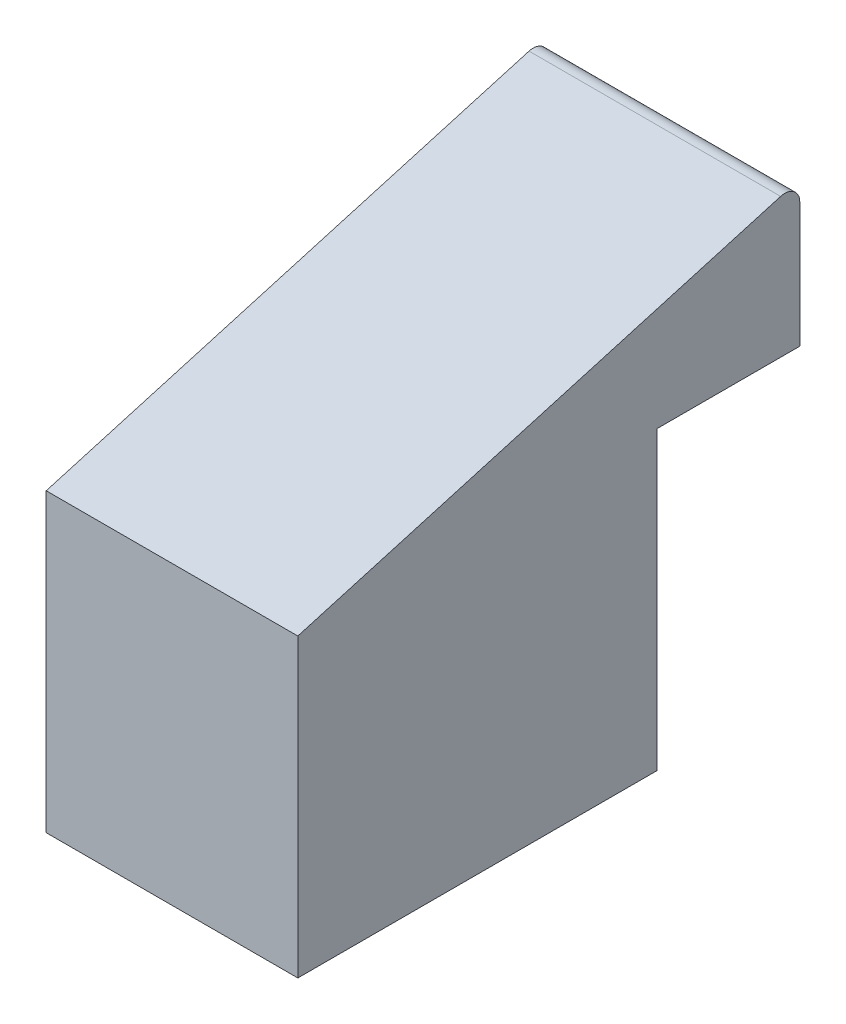
ISO-10303-21;
HEADER;
FILE_DESCRIPTION(('STEP AP214'),'2;1');
FILE_NAME('part.step','',(''),(''),'','','');
FILE_SCHEMA(('AUTOMOTIVE_DESIGN { 1 0 10303 214 1 1 1 1 }'));
ENDSEC;
DATA;
#1=APPLICATION_CONTEXT('core data for automotive mechanical design processes');
#2=APPLICATION_PROTOCOL_DEFINITION('international standard','automotive_design',2000,#1);
#3=PRODUCT_CONTEXT('',#1,'mechanical');
#4=PRODUCT('Part','Part','',(#3));
#5=PRODUCT_RELATED_PRODUCT_CATEGORY('part','',(#4));
#6=PRODUCT_DEFINITION_FORMATION('','',#4);
#7=PRODUCT_DEFINITION_CONTEXT('part definition',#1,'design');
#8=PRODUCT_DEFINITION('design','',#6,#7);
#9=PRODUCT_DEFINITION_SHAPE('','',#8);
#10=(LENGTH_UNIT() NAMED_UNIT(*) SI_UNIT(.MILLI.,.METRE.));
#11=(NAMED_UNIT(*) PLANE_ANGLE_UNIT() SI_UNIT($,.RADIAN.));
#12=(NAMED_UNIT(*) SI_UNIT($,.STERADIAN.) SOLID_ANGLE_UNIT());
#13=UNCERTAINTY_MEASURE_WITH_UNIT(LENGTH_MEASURE(1.E-05),#10,'distance_accuracy_value','');
#14=(GEOMETRIC_REPRESENTATION_CONTEXT(3) GLOBAL_UNCERTAINTY_ASSIGNED_CONTEXT((#13)) GLOBAL_UNIT_ASSIGNED_CONTEXT((#10,
#11,#12)) REPRESENTATION_CONTEXT('',''));
#15=CARTESIAN_POINT('',(0.,0.,0.));
#16=DIRECTION('',(0.,0.,1.));
#17=DIRECTION('',(1.,0.,0.));
#18=AXIS2_PLACEMENT_3D('',#15,#16,#17);
#19=CARTESIAN_POINT('',(2.13449989427818,-8.27705404793357,3.83245450629463));
#20=DIRECTION('',(0.,0.,1.));
#21=DIRECTION('',(1.,0.,0.));
#22=AXIS2_PLACEMENT_3D('',#19,#20,#21);
#23=PLANE('',#22);
#24=DIRECTION('',(0.,-1.,0.));
#25=VECTOR('',#24,1.);
#26=CARTESIAN_POINT('',(4.16649989427817,-8.27705404793357,3.83245450629463));
#27=LINE('',#26,#25);
#28=CARTESIAN_POINT('',(4.16649989427817,-8.27705404793357,3.83245450629463));
#29=VERTEX_POINT('',#28);
#30=CARTESIAN_POINT('',(4.16649989427812,-28.3755392640244,3.83245450629463));
#31=VERTEX_POINT('',#30);
#32=EDGE_CURVE('E65',#29,#31,#27,.T.);
#33=ORIENTED_EDGE('',*,*,#32,.T.);
#34=DIRECTION('',(1.,0.,0.));
#35=VECTOR('',#34,1.);
#36=CARTESIAN_POINT('',(-224.629539586356,-28.3755392640244,3.83245450629463));
#37=LINE('',#36,#35);
#38=CARTESIAN_POINT('',(2.13449989427814,-28.3755392640244,3.83245450629463));
#39=VERTEX_POINT('',#38);
#40=EDGE_CURVE('E146',#39,#31,#37,.T.);
#41=ORIENTED_EDGE('',*,*,#40,.F.);
#42=DIRECTION('',(0.,-1.,0.));
#43=VECTOR('',#42,1.);
#44=CARTESIAN_POINT('',(2.13449989427818,-8.27705404793357,3.83245450629463));
#45=LINE('',#44,#43);
#46=CARTESIAN_POINT('',(2.13449989427818,-8.27705404793357,3.83245450629463));
#47=VERTEX_POINT('',#46);
#48=EDGE_CURVE('E163',#47,#39,#45,.T.);
#49=ORIENTED_EDGE('',*,*,#48,.F.);
#50=DIRECTION('',(-1.,0.,0.));
#51=VECTOR('',#50,1.);
#52=CARTESIAN_POINT('',(2.13449989427818,-8.27705404793357,3.83245450629463));
#53=LINE('',#52,#51);
#54=EDGE_CURVE('E162',#29,#47,#53,.T.);
#55=ORIENTED_EDGE('',*,*,#54,.F.);
#56=EDGE_LOOP('',(#33,#41,#49,#55));
#57=FACE_BOUND('',#56,.T.);
#58=ADVANCED_FACE('F40',(#57),#23,.F.);
#59=CARTESIAN_POINT('',(-33.2280031872799,-8.27705404793357,-5.84762384757291));
#60=DIRECTION('',(0.,0.,-1.));
#61=DIRECTION('',(-1.,0.,0.));
#62=AXIS2_PLACEMENT_3D('',#59,#60,#61);
#63=PLANE('',#62);
#64=DIRECTION('',(1.,0.,0.));
#65=VECTOR('',#64,1.);
#66=CARTESIAN_POINT('',(-33.2280031872799,-0.562858248221526,-5.84762384757291));
#67=LINE('',#66,#65);
#68=CARTESIAN_POINT('',(4.16649989427817,-0.562858248221526,-5.84762384757291));
#69=VERTEX_POINT('',#68);
#70=CARTESIAN_POINT('',(17.1784604136444,-0.562858248221526,-5.84762384757291));
#71=VERTEX_POINT('',#70);
#72=EDGE_CURVE('E232',#69,#71,#67,.T.);
#73=ORIENTED_EDGE('',*,*,#72,.F.);
#74=DIRECTION('',(0.,-1.,0.));
#75=VECTOR('',#74,1.);
#76=CARTESIAN_POINT('',(4.16649989427817,-8.27705404793357,-5.84762384757291));
#77=LINE('',#76,#75);
#78=CARTESIAN_POINT('',(4.16649989427817,-8.27705404793357,-5.84762384757291));
#79=VERTEX_POINT('',#78);
#80=EDGE_CURVE('E236',#69,#79,#77,.T.);
#81=ORIENTED_EDGE('',*,*,#80,.T.);
#82=DIRECTION('',(1.,0.,0.));
#83=VECTOR('',#82,1.);
#84=CARTESIAN_POINT('',(-33.2280031872799,-8.27705404793357,-5.84762384757291));
#85=LINE('',#84,#83);
#86=CARTESIAN_POINT('',(2.13449989427818,-8.27705404793357,-5.84762384757291));
#87=VERTEX_POINT('',#86);
#88=EDGE_CURVE('E186',#87,#79,#85,.T.);
#89=ORIENTED_EDGE('',*,*,#88,.F.);
#90=DIRECTION('',(0.,-1.,0.));
#91=VECTOR('',#90,1.);
#92=CARTESIAN_POINT('',(2.13449989427818,-8.27705404793357,-5.84762384757291));
#93=LINE('',#92,#91);
#94=CARTESIAN_POINT('',(2.13449989427818,0.201428038772017,-5.84762384757291));
#95=VERTEX_POINT('',#94);
#96=EDGE_CURVE('E197',#95,#87,#93,.T.);
#97=ORIENTED_EDGE('',*,*,#96,.F.);
#98=DIRECTION('',(1.,0.,0.));
#99=VECTOR('',#98,1.);
#100=CARTESIAN_POINT('',(-33.2280031872799,0.201428038772017,-5.84762384757291));
#101=LINE('',#100,#99);
#102=CARTESIAN_POINT('',(19.2104604136444,0.201428038772017,-5.84762384757291));
#103=VERTEX_POINT('',#102);
#104=EDGE_CURVE('E190',#95,#103,#101,.T.);
#105=ORIENTED_EDGE('',*,*,#104,.T.);
#106=DIRECTION('',(0.,1.,0.));
#107=VECTOR('',#106,1.);
#108=CARTESIAN_POINT('',(19.2104604136444,-8.27705404793357,-5.84762384757291));
#109=LINE('',#108,#107);
#110=CARTESIAN_POINT('',(19.2104604136444,-8.27705404793357,-5.84762384757291));
#111=VERTEX_POINT('',#110);
#112=EDGE_CURVE('E202',#111,#103,#109,.T.);
#113=ORIENTED_EDGE('',*,*,#112,.F.);
#114=CARTESIAN_POINT('',(17.1784604136444,-8.27705404793357,-5.84762384757291));
#115=VERTEX_POINT('',#114);
#116=EDGE_CURVE('E191',#115,#111,#85,.T.);
#117=ORIENTED_EDGE('',*,*,#116,.F.);
#118=DIRECTION('',(0.,1.,0.));
#119=VECTOR('',#118,1.);
#120=CARTESIAN_POINT('',(17.1784604136444,-8.27705404793357,-5.84762384757291));
#121=LINE('',#120,#119);
#122=EDGE_CURVE('E227',#115,#71,#121,.T.);
#123=ORIENTED_EDGE('',*,*,#122,.T.);
#124=EDGE_LOOP('',(#73,#81,#89,#97,#105,#113,#117,#123));
#125=FACE_BOUND('',#124,.T.);
#126=ADVANCED_FACE('F293',(#125),#63,.T.);
#127=CARTESIAN_POINT('',(-33.2280031872799,-8.27705404793357,28.2164545062946));
#128=DIRECTION('',(0.,-1.,0.));
#129=DIRECTION('',(0.,0.,-1.));
#130=AXIS2_PLACEMENT_3D('',#127,#128,#129);
#131=PLANE('',#130);
#132=CARTESIAN_POINT('',(19.2104604136444,-8.27705404793357,3.83245450629463));
#133=VERTEX_POINT('',#132);
#134=CARTESIAN_POINT('',(17.1784604136444,-8.27705404793357,3.83245450629463));
#135=VERTEX_POINT('',#134);
#136=EDGE_CURVE('E159',#133,#135,#53,.T.);
#137=ORIENTED_EDGE('',*,*,#136,.T.);
#138=DIRECTION('',(0.,0.,-1.));
#139=VECTOR('',#138,1.);
#140=CARTESIAN_POINT('',(17.1784604136444,-8.27705404793357,28.2164545062946));
#141=LINE('',#140,#139);
#142=EDGE_CURVE('E224',#135,#115,#141,.T.);
#143=ORIENTED_EDGE('',*,*,#142,.T.);
#144=ORIENTED_EDGE('',*,*,#116,.T.);
#145=DIRECTION('',(0.,0.,-1.));
#146=VECTOR('',#145,1.);
#147=CARTESIAN_POINT('',(19.2104604136444,-8.27705404793357,28.2164545062946));
#148=LINE('',#147,#146);
#149=EDGE_CURVE('E206',#133,#111,#148,.T.);
#150=ORIENTED_EDGE('',*,*,#149,.F.);
#151=EDGE_LOOP('',(#137,#143,#144,#150));
#152=FACE_BOUND('',#151,.T.);
#153=ADVANCED_FACE('F305',(#152),#131,.T.);
#154=ORIENTED_EDGE('',*,*,#88,.T.);
#155=DIRECTION('',(0.,0.,1.));
#156=VECTOR('',#155,1.);
#157=CARTESIAN_POINT('',(4.16649989427817,-8.27705404793357,28.2164545062946));
#158=LINE('',#157,#156);
#159=EDGE_CURVE('E241',#79,#29,#158,.T.);
#160=ORIENTED_EDGE('',*,*,#159,.T.);
#161=ORIENTED_EDGE('',*,*,#54,.T.);
#162=DIRECTION('',(0.,0.,1.));
#163=VECTOR('',#162,1.);
#164=CARTESIAN_POINT('',(2.13449989427818,-8.27705404793357,28.2164545062946));
#165=LINE('',#164,#163);
#166=EDGE_CURVE('E168',#87,#47,#165,.T.);
#167=ORIENTED_EDGE('',*,*,#166,.F.);
#168=EDGE_LOOP('',(#154,#160,#161,#167));
#169=FACE_BOUND('',#168,.T.);
#170=ADVANCED_FACE('F289',(#169),#131,.T.);
#171=CARTESIAN_POINT('',(2.13449989427818,-8.27705404793357,28.2164545062946));
#172=DIRECTION('',(1.,0.,0.));
#173=DIRECTION('',(0.,0.,-1.));
#174=AXIS2_PLACEMENT_3D('',#171,#172,#173);
#175=PLANE('',#174);
#176=ORIENTED_EDGE('',*,*,#48,.T.);
#177=DIRECTION('',(0.,0.,1.));
#178=VECTOR('',#177,1.);
#179=CARTESIAN_POINT('',(2.13449989427818,-28.3755392640244,28.2164545062946));
#180=LINE('',#179,#178);
#181=CARTESIAN_POINT('',(2.13449989427814,-28.3755392640244,28.2164545062946));
#182=VERTEX_POINT('',#181);
#183=EDGE_CURVE('E264',#39,#182,#180,.T.);
#184=ORIENTED_EDGE('',*,*,#183,.T.);
#185=DIRECTION('',(0.,-1.,0.));
#186=VECTOR('',#185,1.);
#187=CARTESIAN_POINT('',(2.13449989427818,-8.27705404793357,28.2164545062946));
#188=LINE('',#187,#186);
#189=CARTESIAN_POINT('',(2.13449989427818,-8.27705404793357,28.2164545062946));
#190=VERTEX_POINT('',#189);
#191=EDGE_CURVE('E171',#190,#182,#188,.T.);
#192=ORIENTED_EDGE('',*,*,#191,.F.);
#193=DIRECTION('',(0.,0.277236683123786,-0.960801655665997));
#194=VECTOR('',#193,1.);
#195=CARTESIAN_POINT('',(2.13449989427818,1.17760252092869,-4.54995137751914));
#196=LINE('',#195,#194);
#197=CARTESIAN_POINT('',(2.13449989427818,1.17760252092869,-4.54995137751914));
#198=VERTEX_POINT('',#197);
#199=EDGE_CURVE('E185',#190,#198,#196,.T.);
#200=ORIENTED_EDGE('',*,*,#199,.T.);
#201=CARTESIAN_POINT('',(2.13449989427818,0.201428038772031,-4.83162384757292));
#202=DIRECTION('',(1.,0.,0.));
#203=DIRECTION('',(0.,0.,-1.));
#204=AXIS2_PLACEMENT_3D('',#201,#202,#203);
#205=CIRCLE('',#204,1.016);
#206=EDGE_CURVE('E215',#198,#95,#205,.F.);
#207=ORIENTED_EDGE('',*,*,#206,.T.);
#208=ORIENTED_EDGE('',*,*,#96,.T.);
#209=ORIENTED_EDGE('',*,*,#166,.T.);
#210=EDGE_LOOP('',(#176,#184,#192,#200,#207,#208,#209));
#211=FACE_BOUND('',#210,.T.);
#212=ADVANCED_FACE('F42',(#211),#175,.F.);
#213=CARTESIAN_POINT('',(19.2104604136444,-8.27705404793357,28.2164545062946));
#214=DIRECTION('',(-1.,0.,0.));
#215=DIRECTION('',(0.,0.,1.));
#216=AXIS2_PLACEMENT_3D('',#213,#214,#215);
#217=PLANE('',#216);
#218=DIRECTION('',(0.,1.,0.));
#219=VECTOR('',#218,1.);
#220=CARTESIAN_POINT('',(19.2104604136444,-8.27705404793357,28.2164545062946));
#221=LINE('',#220,#219);
#222=CARTESIAN_POINT('',(19.2104604136444,-28.3755392640244,28.2164545062946));
#223=VERTEX_POINT('',#222);
#224=CARTESIAN_POINT('',(19.2104604136444,-8.27705404793357,28.2164545062946));
#225=VERTEX_POINT('',#224);
#226=EDGE_CURVE('E50',#223,#225,#221,.T.);
#227=ORIENTED_EDGE('',*,*,#226,.F.);
#228=DIRECTION('',(0.,0.,1.));
#229=VECTOR('',#228,1.);
#230=CARTESIAN_POINT('',(19.2104604136444,-28.3755392640244,3.83245450629463));
#231=LINE('',#230,#229);
#232=CARTESIAN_POINT('',(19.2104604136444,-28.3755392640244,3.83245450629463));
#233=VERTEX_POINT('',#232);
#234=EDGE_CURVE('E138',#233,#223,#231,.T.);
#235=ORIENTED_EDGE('',*,*,#234,.F.);
#236=DIRECTION('',(0.,1.,0.));
#237=VECTOR('',#236,1.);
#238=CARTESIAN_POINT('',(19.2104604136444,-8.27705404793357,3.83245450629463));
#239=LINE('',#238,#237);
#240=EDGE_CURVE('E152',#233,#133,#239,.T.);
#241=ORIENTED_EDGE('',*,*,#240,.T.);
#242=ORIENTED_EDGE('',*,*,#149,.T.);
#243=ORIENTED_EDGE('',*,*,#112,.T.);
#244=CARTESIAN_POINT('',(19.2104604136444,0.201428038772031,-4.83162384757292));
#245=DIRECTION('',(1.,0.,0.));
#246=DIRECTION('',(0.,0.,-1.));
#247=AXIS2_PLACEMENT_3D('',#244,#245,#246);
#248=CIRCLE('',#247,1.016);
#249=CARTESIAN_POINT('',(19.2104604136444,1.17760252092869,-4.54995137751914));
#250=VERTEX_POINT('',#249);
#251=EDGE_CURVE('E198',#103,#250,#248,.T.);
#252=ORIENTED_EDGE('',*,*,#251,.T.);
#253=DIRECTION('',(0.,-0.277236683123786,0.960801655665997));
#254=VECTOR('',#253,1.);
#255=CARTESIAN_POINT('',(19.2104604136444,1.17760252092869,-4.54995137751914));
#256=LINE('',#255,#254);
#257=EDGE_CURVE('E209',#250,#225,#256,.T.);
#258=ORIENTED_EDGE('',*,*,#257,.T.);
#259=EDGE_LOOP('',(#227,#235,#241,#242,#243,#252,#258));
#260=FACE_BOUND('',#259,.T.);
#261=ADVANCED_FACE('F150',(#260),#217,.F.);
#262=CARTESIAN_POINT('',(2.13449989427818,-8.27705404793357,28.2164545062946));
#263=DIRECTION('',(0.,0.,1.));
#264=DIRECTION('',(1.,0.,0.));
#265=AXIS2_PLACEMENT_3D('',#262,#263,#264);
#266=PLANE('',#265);
#267=DIRECTION('',(1.,0.,0.));
#268=VECTOR('',#267,1.);
#269=CARTESIAN_POINT('',(-224.629539586356,-28.3755392640244,28.2164545062946));
#270=LINE('',#269,#268);
#271=EDGE_CURVE('E275',#182,#223,#270,.T.);
#272=ORIENTED_EDGE('',*,*,#271,.T.);
#273=ORIENTED_EDGE('',*,*,#226,.T.);
#274=DIRECTION('',(-1.,0.,0.));
#275=VECTOR('',#274,1.);
#276=CARTESIAN_POINT('',(2.13449989427818,-8.27705404793357,28.2164545062946));
#277=LINE('',#276,#275);
#278=EDGE_CURVE('E11',#225,#190,#277,.T.);
#279=ORIENTED_EDGE('',*,*,#278,.T.);
#280=ORIENTED_EDGE('',*,*,#191,.T.);
#281=EDGE_LOOP('',(#272,#273,#279,#280));
#282=FACE_BOUND('',#281,.T.);
#283=ADVANCED_FACE('F319',(#282),#266,.T.);
#284=ORIENTED_EDGE('',*,*,#240,.F.);
#285=CARTESIAN_POINT('',(17.1784604136443,-28.3755392640244,3.83245450629463));
#286=VERTEX_POINT('',#285);
#287=EDGE_CURVE('E135',#286,#233,#37,.T.);
#288=ORIENTED_EDGE('',*,*,#287,.F.);
#289=DIRECTION('',(0.,1.,0.));
#290=VECTOR('',#289,1.);
#291=CARTESIAN_POINT('',(17.1784604136444,-8.27705404793357,3.83245450629463));
#292=LINE('',#291,#290);
#293=EDGE_CURVE('E220',#286,#135,#292,.T.);
#294=ORIENTED_EDGE('',*,*,#293,.T.);
#295=ORIENTED_EDGE('',*,*,#136,.F.);
#296=EDGE_LOOP('',(#284,#288,#294,#295));
#297=FACE_BOUND('',#296,.T.);
#298=ADVANCED_FACE('F157',(#297),#23,.F.);
#299=CARTESIAN_POINT('',(-33.2280031872799,1.17760252092869,-4.54995137751914));
#300=DIRECTION('',(0.,0.960801655665997,0.277236683123786));
#301=DIRECTION('',(0.,-0.277236683123786,0.960801655665997));
#302=AXIS2_PLACEMENT_3D('',#299,#300,#301);
#303=PLANE('',#302);
#304=ORIENTED_EDGE('',*,*,#199,.F.);
#305=ORIENTED_EDGE('',*,*,#278,.F.);
#306=ORIENTED_EDGE('',*,*,#257,.F.);
#307=DIRECTION('',(1.,0.,0.));
#308=VECTOR('',#307,1.);
#309=CARTESIAN_POINT('',(-33.2280031872799,1.17760252092869,-4.54995137751914));
#310=LINE('',#309,#308);
#311=EDGE_CURVE('E194',#198,#250,#310,.T.);
#312=ORIENTED_EDGE('',*,*,#311,.F.);
#313=EDGE_LOOP('',(#304,#305,#306,#312));
#314=FACE_BOUND('',#313,.T.);
#315=ADVANCED_FACE('F318',(#314),#303,.T.);
#316=CARTESIAN_POINT('',(-33.2280031872799,0.201428038772031,-4.83162384757292));
#317=DIRECTION('',(1.,0.,0.));
#318=DIRECTION('',(0.,0.,-1.));
#319=AXIS2_PLACEMENT_3D('',#316,#317,#318);
#320=CYLINDRICAL_SURFACE('',#319,1.016);
#321=ORIENTED_EDGE('',*,*,#206,.F.);
#322=ORIENTED_EDGE('',*,*,#311,.T.);
#323=ORIENTED_EDGE('',*,*,#251,.F.);
#324=ORIENTED_EDGE('',*,*,#104,.F.);
#325=EDGE_LOOP('',(#321,#322,#323,#324));
#326=FACE_BOUND('',#325,.T.);
#327=ADVANCED_FACE('F312',(#326),#320,.T.);
#328=CARTESIAN_POINT('',(4.16649989427817,-8.27705404793357,28.2164545062946));
#329=DIRECTION('',(1.,0.,0.));
#330=DIRECTION('',(0.,0.,-1.));
#331=AXIS2_PLACEMENT_3D('',#328,#329,#330);
#332=PLANE('',#331);
#333=DIRECTION('',(0.,0.,1.));
#334=VECTOR('',#333,1.);
#335=CARTESIAN_POINT('',(4.16649989427817,-28.3755392640244,28.2164545062946));
#336=LINE('',#335,#334);
#337=CARTESIAN_POINT('',(4.16649989427817,-28.3755392640244,26.1844545062946));
#338=VERTEX_POINT('',#337);
#339=EDGE_CURVE('E58',#31,#338,#336,.T.);
#340=ORIENTED_EDGE('',*,*,#339,.F.);
#341=ORIENTED_EDGE('',*,*,#32,.F.);
#342=ORIENTED_EDGE('',*,*,#159,.F.);
#343=ORIENTED_EDGE('',*,*,#80,.F.);
#344=DIRECTION('',(0.,0.277236683123786,-0.960801655665997));
#345=VECTOR('',#344,1.);
#346=CARTESIAN_POINT('',(4.16649989427817,-0.774746443384627,-5.11329631762668));
#347=LINE('',#346,#345);
#348=CARTESIAN_POINT('',(4.16649989427817,-9.80562662192069,26.1844545062946));
#349=VERTEX_POINT('',#348);
#350=EDGE_CURVE('E240',#349,#69,#347,.T.);
#351=ORIENTED_EDGE('',*,*,#350,.F.);
#352=DIRECTION('',(0.,-1.,0.));
#353=VECTOR('',#352,1.);
#354=CARTESIAN_POINT('',(4.16649989427817,-8.27705404793357,26.1844545062946));
#355=LINE('',#354,#353);
#356=EDGE_CURVE('E223',#349,#338,#355,.T.);
#357=ORIENTED_EDGE('',*,*,#356,.T.);
#358=EDGE_LOOP('',(#340,#341,#342,#343,#351,#357));
#359=FACE_BOUND('',#358,.T.);
#360=ADVANCED_FACE('F283',(#359),#332,.T.);
#361=CARTESIAN_POINT('',(17.1784604136444,-8.27705404793357,28.2164545062946));
#362=DIRECTION('',(-1.,0.,0.));
#363=DIRECTION('',(0.,0.,1.));
#364=AXIS2_PLACEMENT_3D('',#361,#362,#363);
#365=PLANE('',#364);
#366=DIRECTION('',(0.,0.,-1.));
#367=VECTOR('',#366,1.);
#368=CARTESIAN_POINT('',(17.1784604136444,-28.3755392640244,28.2164545062946));
#369=LINE('',#368,#367);
#370=CARTESIAN_POINT('',(17.1784604136444,-28.3755392640244,26.1844545062946));
#371=VERTEX_POINT('',#370);
#372=EDGE_CURVE('E141',#371,#286,#369,.T.);
#373=ORIENTED_EDGE('',*,*,#372,.F.);
#374=DIRECTION('',(0.,1.,0.));
#375=VECTOR('',#374,1.);
#376=CARTESIAN_POINT('',(17.1784604136444,-8.27705404793357,26.1844545062946));
#377=LINE('',#376,#375);
#378=CARTESIAN_POINT('',(17.1784604136444,-9.80562662192069,26.1844545062946));
#379=VERTEX_POINT('',#378);
#380=EDGE_CURVE('E252',#371,#379,#377,.T.);
#381=ORIENTED_EDGE('',*,*,#380,.T.);
#382=DIRECTION('',(0.,-0.277236683123786,0.960801655665997));
#383=VECTOR('',#382,1.);
#384=CARTESIAN_POINT('',(17.1784604136444,-0.774746443384627,-5.11329631762668));
#385=LINE('',#384,#383);
#386=EDGE_CURVE('E228',#71,#379,#385,.T.);
#387=ORIENTED_EDGE('',*,*,#386,.F.);
#388=ORIENTED_EDGE('',*,*,#122,.F.);
#389=ORIENTED_EDGE('',*,*,#142,.F.);
#390=ORIENTED_EDGE('',*,*,#293,.F.);
#391=EDGE_LOOP('',(#373,#381,#387,#388,#389,#390));
#392=FACE_BOUND('',#391,.T.);
#393=ADVANCED_FACE('F303',(#392),#365,.T.);
#394=CARTESIAN_POINT('',(2.13449989427818,-8.27705404793357,26.1844545062946));
#395=DIRECTION('',(0.,0.,1.));
#396=DIRECTION('',(1.,0.,0.));
#397=AXIS2_PLACEMENT_3D('',#394,#395,#396);
#398=PLANE('',#397);
#399=ORIENTED_EDGE('',*,*,#380,.F.);
#400=DIRECTION('',(-1.,0.,0.));
#401=VECTOR('',#400,1.);
#402=CARTESIAN_POINT('',(2.13449989427818,-28.3755392640244,26.1844545062946));
#403=LINE('',#402,#401);
#404=EDGE_CURVE('E272',#371,#338,#403,.T.);
#405=ORIENTED_EDGE('',*,*,#404,.T.);
#406=ORIENTED_EDGE('',*,*,#356,.F.);
#407=DIRECTION('',(-1.,0.,0.));
#408=VECTOR('',#407,1.);
#409=CARTESIAN_POINT('',(2.13449989427818,-9.80562662192069,26.1844545062946));
#410=LINE('',#409,#408);
#411=EDGE_CURVE('E212',#379,#349,#410,.T.);
#412=ORIENTED_EDGE('',*,*,#411,.F.);
#413=EDGE_LOOP('',(#399,#405,#406,#412));
#414=FACE_BOUND('',#413,.T.);
#415=ADVANCED_FACE('F301',(#414),#398,.F.);
#416=CARTESIAN_POINT('',(-33.2280031872799,-0.774746443384627,-5.11329631762668));
#417=DIRECTION('',(0.,0.960801655665997,0.277236683123786));
#418=DIRECTION('',(0.,-0.277236683123786,0.960801655665997));
#419=AXIS2_PLACEMENT_3D('',#416,#417,#418);
#420=PLANE('',#419);
#421=CARTESIAN_POINT('',(10.6724801539613,-7.01748087991953,16.5217539755834));
#422=DIRECTION('',(0.,0.960801655665997,0.277236683123786));
#423=DIRECTION('',(0.,-0.277236683123786,0.960801655665997));
#424=AXIS2_PLACEMENT_3D('',#421,#422,#423);
#425=ELLIPSE('',#424,2.74325739283258,2.63572624495153);
#426=CARTESIAN_POINT('',(10.6724801539613,-7.77801246046324,19.157480220535));
#427=VERTEX_POINT('',#426);
#428=EDGE_CURVE('E249',#427,#427,#425,.F.);
#429=ORIENTED_EDGE('',*,*,#428,.F.);
#430=EDGE_LOOP('',(#429));
#431=FACE_BOUND('',#430,.T.);
#432=ORIENTED_EDGE('',*,*,#350,.T.);
#433=ORIENTED_EDGE('',*,*,#72,.T.);
#434=ORIENTED_EDGE('',*,*,#386,.T.);
#435=ORIENTED_EDGE('',*,*,#411,.T.);
#436=EDGE_LOOP('',(#432,#433,#434,#435));
#437=FACE_BOUND('',#436,.T.);
#438=ADVANCED_FACE('F297',(#431,#437),#420,.F.);
#439=CARTESIAN_POINT('',(10.6724801539613,0.589550732417732,16.5217539755834));
#440=DIRECTION('',(0.,-1.,0.));
#441=DIRECTION('',(0.,0.,-1.));
#442=AXIS2_PLACEMENT_3D('',#439,#440,#441);
#443=CYLINDRICAL_SURFACE('',#442,2.63572624495153);
#444=CARTESIAN_POINT('',(10.6724801539613,-28.3755392640244,16.5217539755834));
#445=DIRECTION('',(0.,1.,0.));
#446=DIRECTION('',(0.,0.,1.));
#447=AXIS2_PLACEMENT_3D('',#444,#445,#446);
#448=CIRCLE('',#447,2.63572624495153);
#449=CARTESIAN_POINT('',(10.6724801539613,-28.3755392640244,19.157480220535));
#450=VERTEX_POINT('',#449);
#451=EDGE_CURVE('E44',#450,#450,#448,.F.);
#452=ORIENTED_EDGE('',*,*,#451,.F.);
#453=EDGE_LOOP('',(#452));
#454=FACE_BOUND('',#453,.T.);
#455=ORIENTED_EDGE('',*,*,#428,.T.);
#456=EDGE_LOOP('',(#455));
#457=FACE_BOUND('',#456,.T.);
#458=ADVANCED_FACE('F348',(#454,#457),#443,.T.);
#459=CARTESIAN_POINT('',(-224.629539586356,-28.3755392640244,3.83245450629463));
#460=DIRECTION('',(0.,1.,0.));
#461=DIRECTION('',(0.,0.,1.));
#462=AXIS2_PLACEMENT_3D('',#459,#460,#461);
#463=PLANE('',#462);
#464=ORIENTED_EDGE('',*,*,#451,.T.);
#465=EDGE_LOOP('',(#464));
#466=FACE_BOUND('',#465,.T.);
#467=ADVANCED_FACE('F358',(#466),#463,.F.);
#468=ORIENTED_EDGE('',*,*,#40,.T.);
#469=ORIENTED_EDGE('',*,*,#339,.T.);
#470=ORIENTED_EDGE('',*,*,#404,.F.);
#471=ORIENTED_EDGE('',*,*,#372,.T.);
#472=ORIENTED_EDGE('',*,*,#287,.T.);
#473=ORIENTED_EDGE('',*,*,#234,.T.);
#474=ORIENTED_EDGE('',*,*,#271,.F.);
#475=ORIENTED_EDGE('',*,*,#183,.F.);
#476=EDGE_LOOP('',(#468,#469,#470,#471,#472,#473,#474,#475));
#477=FACE_BOUND('',#476,.T.);
#478=ADVANCED_FACE('F137',(#477),#463,.F.);
#479=CLOSED_SHELL('',(#58,#126,#153,#170,#212,#261,#283,#298,#315,#327,#360,#393,#415,#438,#458,
#467,#478));
#480=MANIFOLD_SOLID_BREP('B2',#479);
#481=ADVANCED_BREP_SHAPE_REPRESENTATION('',(#18,#480),#14);
#482=SHAPE_DEFINITION_REPRESENTATION(#9,#481);
ENDSEC;
END-ISO-10303-21;
